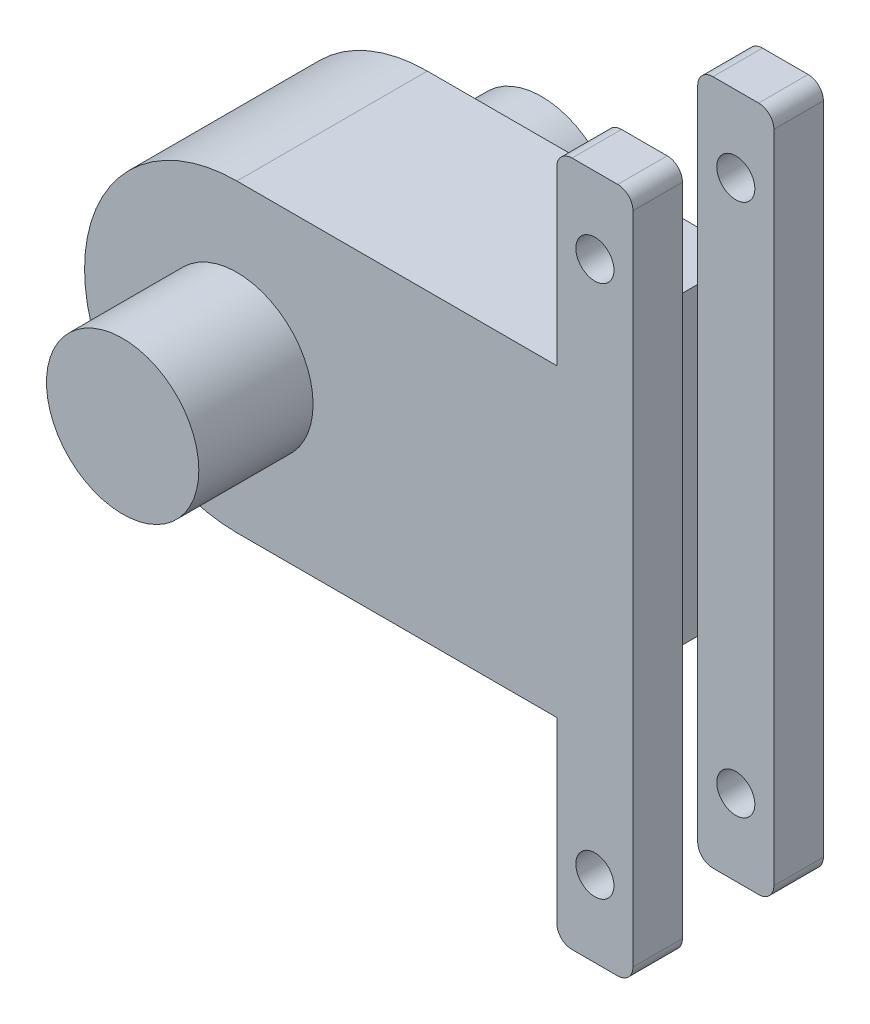
ISO-10303-21;
HEADER;
FILE_DESCRIPTION(('STEP AP214'),'2;1');
FILE_NAME('part.step','',(''),(''),'','','');
FILE_SCHEMA(('AUTOMOTIVE_DESIGN { 1 0 10303 214 1 1 1 1 }'));
ENDSEC;
DATA;
#1=APPLICATION_CONTEXT('core data for automotive mechanical design processes');
#2=APPLICATION_PROTOCOL_DEFINITION('international standard','automotive_design',2000,#1);
#3=PRODUCT_CONTEXT('',#1,'mechanical');
#4=PRODUCT('Part','Part','',(#3));
#5=PRODUCT_RELATED_PRODUCT_CATEGORY('part','',(#4));
#6=PRODUCT_DEFINITION_FORMATION('','',#4);
#7=PRODUCT_DEFINITION_CONTEXT('part definition',#1,'design');
#8=PRODUCT_DEFINITION('design','',#6,#7);
#9=PRODUCT_DEFINITION_SHAPE('','',#8);
#10=(LENGTH_UNIT() NAMED_UNIT(*) SI_UNIT(.MILLI.,.METRE.));
#11=(NAMED_UNIT(*) PLANE_ANGLE_UNIT() SI_UNIT($,.RADIAN.));
#12=(NAMED_UNIT(*) SI_UNIT($,.STERADIAN.) SOLID_ANGLE_UNIT());
#13=UNCERTAINTY_MEASURE_WITH_UNIT(LENGTH_MEASURE(1.E-05),#10,'distance_accuracy_value','');
#14=(GEOMETRIC_REPRESENTATION_CONTEXT(3) GLOBAL_UNCERTAINTY_ASSIGNED_CONTEXT((#13)) GLOBAL_UNIT_ASSIGNED_CONTEXT((#10,
#11,#12)) REPRESENTATION_CONTEXT('',''));
#15=CARTESIAN_POINT('',(0.,0.,0.));
#16=DIRECTION('',(0.,0.,1.));
#17=DIRECTION('',(1.,0.,0.));
#18=AXIS2_PLACEMENT_3D('',#15,#16,#17);
#19=CARTESIAN_POINT('',(42.,-45.,25.));
#20=DIRECTION('',(1.,0.,0.));
#21=DIRECTION('',(0.,1.,0.));
#22=AXIS2_PLACEMENT_3D('',#19,#20,#21);
#23=PLANE('',#22);
#24=DIRECTION('',(0.,-1.,0.));
#25=VECTOR('',#24,1.);
#26=CARTESIAN_POINT('',(42.,-45.,0.));
#27=LINE('',#26,#25);
#28=CARTESIAN_POINT('',(42.,-19.6168866981132,0.));
#29=VERTEX_POINT('',#28);
#30=CARTESIAN_POINT('',(42.,-43.,0.));
#31=VERTEX_POINT('',#30);
#32=EDGE_CURVE('E373',#29,#31,#27,.T.);
#33=ORIENTED_EDGE('',*,*,#32,.T.);
#34=DIRECTION('',(0.,0.,-1.));
#35=VECTOR('',#34,1.);
#36=CARTESIAN_POINT('',(42.,-43.,25.));
#37=LINE('',#36,#35);
#38=CARTESIAN_POINT('',(42.,-43.,6.5));
#39=VERTEX_POINT('',#38);
#40=EDGE_CURVE('E11',#31,#39,#37,.F.);
#41=ORIENTED_EDGE('',*,*,#40,.T.);
#42=DIRECTION('',(0.,1.,0.));
#43=VECTOR('',#42,1.);
#44=CARTESIAN_POINT('',(42.,-45.,6.5));
#45=LINE('',#44,#43);
#46=CARTESIAN_POINT('',(42.,-19.6168866981132,6.5));
#47=VERTEX_POINT('',#46);
#48=EDGE_CURVE('E252',#39,#47,#45,.T.);
#49=ORIENTED_EDGE('',*,*,#48,.T.);
#50=DIRECTION('',(0.,0.,-1.));
#51=VECTOR('',#50,1.);
#52=CARTESIAN_POINT('',(42.,-19.6168866981132,25.));
#53=LINE('',#52,#51);
#54=EDGE_CURVE('E227',#47,#29,#53,.T.);
#55=ORIENTED_EDGE('',*,*,#54,.T.);
#56=EDGE_LOOP('',(#33,#41,#49,#55));
#57=FACE_BOUND('',#56,.T.);
#58=ADVANCED_FACE('F45',(#57),#23,.F.);
#59=CARTESIAN_POINT('',(52.,-45.,25.));
#60=DIRECTION('',(0.,1.,0.));
#61=DIRECTION('',(0.,0.,1.));
#62=AXIS2_PLACEMENT_3D('',#59,#60,#61);
#63=PLANE('',#62);
#64=DIRECTION('',(-1.,0.,0.));
#65=VECTOR('',#64,1.);
#66=CARTESIAN_POINT('',(52.0157323800917,-45.,6.5));
#67=LINE('',#66,#65);
#68=CARTESIAN_POINT('',(50.,-45.,6.5));
#69=VERTEX_POINT('',#68);
#70=CARTESIAN_POINT('',(44.,-45.,6.5));
#71=VERTEX_POINT('',#70);
#72=EDGE_CURVE('E361',#69,#71,#67,.T.);
#73=ORIENTED_EDGE('',*,*,#72,.T.);
#74=DIRECTION('',(0.,0.,-1.));
#75=VECTOR('',#74,1.);
#76=CARTESIAN_POINT('',(44.,-45.,25.));
#77=LINE('',#76,#75);
#78=CARTESIAN_POINT('',(44.,-45.,0.));
#79=VERTEX_POINT('',#78);
#80=EDGE_CURVE('E54',#71,#79,#77,.T.);
#81=ORIENTED_EDGE('',*,*,#80,.T.);
#82=DIRECTION('',(1.,0.,0.));
#83=VECTOR('',#82,1.);
#84=CARTESIAN_POINT('',(52.,-45.,0.));
#85=LINE('',#84,#83);
#86=CARTESIAN_POINT('',(50.,-45.,0.));
#87=VERTEX_POINT('',#86);
#88=EDGE_CURVE('E359',#79,#87,#85,.T.);
#89=ORIENTED_EDGE('',*,*,#88,.T.);
#90=DIRECTION('',(0.,0.,-1.));
#91=VECTOR('',#90,1.);
#92=CARTESIAN_POINT('',(50.,-45.,25.));
#93=LINE('',#92,#91);
#94=EDGE_CURVE('E349',#87,#69,#93,.F.);
#95=ORIENTED_EDGE('',*,*,#94,.T.);
#96=EDGE_LOOP('',(#73,#81,#89,#95));
#97=FACE_BOUND('',#96,.T.);
#98=ADVANCED_FACE('F358',(#97),#63,.F.);
#99=CARTESIAN_POINT('',(52.,45.,25.));
#100=DIRECTION('',(-1.,0.,0.));
#101=DIRECTION('',(0.,-1.,0.));
#102=AXIS2_PLACEMENT_3D('',#99,#100,#101);
#103=PLANE('',#102);
#104=DIRECTION('',(0.,1.,0.));
#105=VECTOR('',#104,1.);
#106=CARTESIAN_POINT('',(52.,45.,0.));
#107=LINE('',#106,#105);
#108=CARTESIAN_POINT('',(52.,-43.,0.));
#109=VERTEX_POINT('',#108);
#110=CARTESIAN_POINT('',(52.,43.,0.));
#111=VERTEX_POINT('',#110);
#112=EDGE_CURVE('E372',#109,#111,#107,.T.);
#113=ORIENTED_EDGE('',*,*,#112,.T.);
#114=DIRECTION('',(0.,0.,-1.));
#115=VECTOR('',#114,1.);
#116=CARTESIAN_POINT('',(52.,43.,25.));
#117=LINE('',#116,#115);
#118=CARTESIAN_POINT('',(52.,43.,6.50000000000001));
#119=VERTEX_POINT('',#118);
#120=EDGE_CURVE('E68',#111,#119,#117,.F.);
#121=ORIENTED_EDGE('',*,*,#120,.T.);
#122=DIRECTION('',(0.,-1.,0.));
#123=VECTOR('',#122,1.);
#124=CARTESIAN_POINT('',(52.,45.,6.50000000000001));
#125=LINE('',#124,#123);
#126=CARTESIAN_POINT('',(52.,-43.,6.50000000000001));
#127=VERTEX_POINT('',#126);
#128=EDGE_CURVE('E230',#119,#127,#125,.T.);
#129=ORIENTED_EDGE('',*,*,#128,.T.);
#130=DIRECTION('',(0.,0.,-1.));
#131=VECTOR('',#130,1.);
#132=CARTESIAN_POINT('',(52.,-43.,25.));
#133=LINE('',#132,#131);
#134=EDGE_CURVE('E326',#127,#109,#133,.T.);
#135=ORIENTED_EDGE('',*,*,#134,.T.);
#136=EDGE_LOOP('',(#113,#121,#129,#135));
#137=FACE_BOUND('',#136,.T.);
#138=ADVANCED_FACE('F452',(#137),#103,.F.);
#139=CARTESIAN_POINT('',(42.,45.,25.));
#140=DIRECTION('',(0.,-1.,0.));
#141=DIRECTION('',(0.,0.,-1.));
#142=AXIS2_PLACEMENT_3D('',#139,#140,#141);
#143=PLANE('',#142);
#144=DIRECTION('',(-1.,0.,0.));
#145=VECTOR('',#144,1.);
#146=CARTESIAN_POINT('',(42.,45.,0.));
#147=LINE('',#146,#145);
#148=CARTESIAN_POINT('',(50.,45.,0.));
#149=VERTEX_POINT('',#148);
#150=CARTESIAN_POINT('',(44.,45.,0.));
#151=VERTEX_POINT('',#150);
#152=EDGE_CURVE('E377',#149,#151,#147,.T.);
#153=ORIENTED_EDGE('',*,*,#152,.T.);
#154=DIRECTION('',(0.,0.,-1.));
#155=VECTOR('',#154,1.);
#156=CARTESIAN_POINT('',(44.,45.,25.));
#157=LINE('',#156,#155);
#158=CARTESIAN_POINT('',(44.,45.,6.5));
#159=VERTEX_POINT('',#158);
#160=EDGE_CURVE('E312',#151,#159,#157,.F.);
#161=ORIENTED_EDGE('',*,*,#160,.T.);
#162=DIRECTION('',(1.,0.,0.));
#163=VECTOR('',#162,1.);
#164=CARTESIAN_POINT('',(42.,45.,6.5));
#165=LINE('',#164,#163);
#166=CARTESIAN_POINT('',(50.,45.,6.5));
#167=VERTEX_POINT('',#166);
#168=EDGE_CURVE('E448',#159,#167,#165,.T.);
#169=ORIENTED_EDGE('',*,*,#168,.T.);
#170=DIRECTION('',(0.,0.,-1.));
#171=VECTOR('',#170,1.);
#172=CARTESIAN_POINT('',(50.,45.,25.));
#173=LINE('',#172,#171);
#174=EDGE_CURVE('E308',#167,#149,#173,.T.);
#175=ORIENTED_EDGE('',*,*,#174,.T.);
#176=EDGE_LOOP('',(#153,#161,#169,#175));
#177=FACE_BOUND('',#176,.T.);
#178=ADVANCED_FACE('F445',(#177),#143,.F.);
#179=CARTESIAN_POINT('',(42.,20.3831133018868,25.));
#180=DIRECTION('',(1.,0.,0.));
#181=DIRECTION('',(0.,1.,0.));
#182=AXIS2_PLACEMENT_3D('',#179,#180,#181);
#183=PLANE('',#182);
#184=CARTESIAN_POINT('',(42.,20.3831133018868,6.50000000000001));
#185=VERTEX_POINT('',#184);
#186=CARTESIAN_POINT('',(42.,43.,6.5));
#187=VERTEX_POINT('',#186);
#188=EDGE_CURVE('E208',#185,#187,#45,.T.);
#189=ORIENTED_EDGE('',*,*,#188,.T.);
#190=DIRECTION('',(0.,0.,-1.));
#191=VECTOR('',#190,1.);
#192=CARTESIAN_POINT('',(42.,43.,25.));
#193=LINE('',#192,#191);
#194=CARTESIAN_POINT('',(42.,43.,0.));
#195=VERTEX_POINT('',#194);
#196=EDGE_CURVE('E292',#187,#195,#193,.T.);
#197=ORIENTED_EDGE('',*,*,#196,.T.);
#198=DIRECTION('',(0.,-1.,0.));
#199=VECTOR('',#198,1.);
#200=CARTESIAN_POINT('',(42.,20.3831133018868,0.));
#201=LINE('',#200,#199);
#202=CARTESIAN_POINT('',(42.,20.3831133018868,0.));
#203=VERTEX_POINT('',#202);
#204=EDGE_CURVE('E386',#195,#203,#201,.T.);
#205=ORIENTED_EDGE('',*,*,#204,.T.);
#206=DIRECTION('',(0.,0.,-1.));
#207=VECTOR('',#206,1.);
#208=CARTESIAN_POINT('',(42.,20.3831133018868,25.));
#209=LINE('',#208,#207);
#210=EDGE_CURVE('E395',#185,#203,#209,.T.);
#211=ORIENTED_EDGE('',*,*,#210,.F.);
#212=EDGE_LOOP('',(#189,#197,#205,#211));
#213=FACE_BOUND('',#212,.T.);
#214=ADVANCED_FACE('F437',(#213),#183,.F.);
#215=CARTESIAN_POINT('',(47.,35.,25.));
#216=DIRECTION('',(0.,0.,-1.));
#217=DIRECTION('',(-1.,0.,0.));
#218=AXIS2_PLACEMENT_3D('',#215,#216,#217);
#219=CYLINDRICAL_SURFACE('',#218,2.5);
#220=CARTESIAN_POINT('',(47.,35.,6.5));
#221=DIRECTION('',(0.,0.,-1.));
#222=DIRECTION('',(-1.,0.,0.));
#223=AXIS2_PLACEMENT_3D('',#220,#221,#222);
#224=CIRCLE('',#223,2.5);
#225=CARTESIAN_POINT('',(44.5,35.,6.5));
#226=VERTEX_POINT('',#225);
#227=EDGE_CURVE('E257',#226,#226,#224,.T.);
#228=ORIENTED_EDGE('',*,*,#227,.F.);
#229=EDGE_LOOP('',(#228));
#230=FACE_BOUND('',#229,.T.);
#231=CARTESIAN_POINT('',(47.,35.,0.));
#232=DIRECTION('',(0.,0.,1.));
#233=DIRECTION('',(1.,0.,0.));
#234=AXIS2_PLACEMENT_3D('',#231,#232,#233);
#235=CIRCLE('',#234,2.5);
#236=CARTESIAN_POINT('',(49.5,35.,0.));
#237=VERTEX_POINT('',#236);
#238=EDGE_CURVE('E754',#237,#237,#235,.T.);
#239=ORIENTED_EDGE('',*,*,#238,.F.);
#240=EDGE_LOOP('',(#239));
#241=FACE_BOUND('',#240,.T.);
#242=ADVANCED_FACE('F600',(#230,#241),#219,.F.);
#243=CARTESIAN_POINT('',(47.,-35.,25.));
#244=DIRECTION('',(0.,0.,-1.));
#245=DIRECTION('',(-1.,0.,0.));
#246=AXIS2_PLACEMENT_3D('',#243,#244,#245);
#247=CYLINDRICAL_SURFACE('',#246,2.5);
#248=CARTESIAN_POINT('',(47.,-35.,6.5));
#249=DIRECTION('',(0.,0.,-1.));
#250=DIRECTION('',(-1.,0.,0.));
#251=AXIS2_PLACEMENT_3D('',#248,#249,#250);
#252=CIRCLE('',#251,2.5);
#253=CARTESIAN_POINT('',(44.5,-35.,6.5));
#254=VERTEX_POINT('',#253);
#255=EDGE_CURVE('E253',#254,#254,#252,.T.);
#256=ORIENTED_EDGE('',*,*,#255,.F.);
#257=EDGE_LOOP('',(#256));
#258=FACE_BOUND('',#257,.T.);
#259=CARTESIAN_POINT('',(47.,-35.,0.));
#260=DIRECTION('',(0.,0.,1.));
#261=DIRECTION('',(-1.,0.,0.));
#262=AXIS2_PLACEMENT_3D('',#259,#260,#261);
#263=CIRCLE('',#262,2.5);
#264=CARTESIAN_POINT('',(44.5,-35.,0.));
#265=VERTEX_POINT('',#264);
#266=EDGE_CURVE('E755',#265,#265,#263,.T.);
#267=ORIENTED_EDGE('',*,*,#266,.F.);
#268=EDGE_LOOP('',(#267));
#269=FACE_BOUND('',#268,.T.);
#270=ADVANCED_FACE('F611',(#258,#269),#247,.F.);
#271=CARTESIAN_POINT('',(0.,0.383113301886791,25.));
#272=DIRECTION('',(0.,0.,1.));
#273=DIRECTION('',(1.,0.,0.));
#274=AXIS2_PLACEMENT_3D('',#271,#272,#273);
#275=PLANE('',#274);
#276=CARTESIAN_POINT('',(0.,0.,25.));
#277=DIRECTION('',(0.,0.,1.));
#278=DIRECTION('',(1.,0.,0.));
#279=AXIS2_PLACEMENT_3D('',#276,#277,#278);
#280=CIRCLE('',#279,10.);
#281=CARTESIAN_POINT('',(10.,0.,25.));
#282=VERTEX_POINT('',#281);
#283=EDGE_CURVE('E742',#282,#282,#280,.T.);
#284=ORIENTED_EDGE('',*,*,#283,.F.);
#285=EDGE_LOOP('',(#284));
#286=FACE_BOUND('',#285,.T.);
#287=CARTESIAN_POINT('',(47.,35.,25.));
#288=DIRECTION('',(0.,0.,1.));
#289=DIRECTION('',(1.,0.,0.));
#290=AXIS2_PLACEMENT_3D('',#287,#288,#289);
#291=CIRCLE('',#290,2.5);
#292=CARTESIAN_POINT('',(49.5,35.,25.));
#293=VERTEX_POINT('',#292);
#294=EDGE_CURVE('E417',#293,#293,#291,.T.);
#295=ORIENTED_EDGE('',*,*,#294,.F.);
#296=EDGE_LOOP('',(#295));
#297=FACE_BOUND('',#296,.T.);
#298=DIRECTION('',(-1.,0.,0.));
#299=VECTOR('',#298,1.);
#300=CARTESIAN_POINT('',(42.,45.,25.));
#301=LINE('',#300,#299);
#302=CARTESIAN_POINT('',(50.,45.,25.));
#303=VERTEX_POINT('',#302);
#304=CARTESIAN_POINT('',(44.,45.,25.));
#305=VERTEX_POINT('',#304);
#306=EDGE_CURVE('E411',#303,#305,#301,.T.);
#307=ORIENTED_EDGE('',*,*,#306,.T.);
#308=CARTESIAN_POINT('',(44.,43.,25.));
#309=DIRECTION('',(0.,0.,1.));
#310=DIRECTION('',(1.,0.,0.));
#311=AXIS2_PLACEMENT_3D('',#308,#309,#310);
#312=CIRCLE('',#311,2.);
#313=CARTESIAN_POINT('',(42.,43.,25.));
#314=VERTEX_POINT('',#313);
#315=EDGE_CURVE('E289',#305,#314,#312,.T.);
#316=ORIENTED_EDGE('',*,*,#315,.T.);
#317=DIRECTION('',(0.,-1.,0.));
#318=VECTOR('',#317,1.);
#319=CARTESIAN_POINT('',(42.,20.3831133018868,25.));
#320=LINE('',#319,#318);
#321=CARTESIAN_POINT('',(42.,20.3831133018868,25.));
#322=VERTEX_POINT('',#321);
#323=EDGE_CURVE('E405',#314,#322,#320,.T.);
#324=ORIENTED_EDGE('',*,*,#323,.T.);
#325=DIRECTION('',(-1.,0.,0.));
#326=VECTOR('',#325,1.);
#327=CARTESIAN_POINT('',(0.,20.3831133018868,25.));
#328=LINE('',#327,#326);
#329=CARTESIAN_POINT('',(0.,20.3831133018868,25.));
#330=VERTEX_POINT('',#329);
#331=EDGE_CURVE('E396',#322,#330,#328,.T.);
#332=ORIENTED_EDGE('',*,*,#331,.T.);
#333=CARTESIAN_POINT('',(0.,0.383113301886791,25.));
#334=DIRECTION('',(0.,0.,1.));
#335=DIRECTION('',(1.,0.,0.));
#336=AXIS2_PLACEMENT_3D('',#333,#334,#335);
#337=CIRCLE('',#336,20.);
#338=CARTESIAN_POINT('',(0.,-19.6168866981132,25.));
#339=VERTEX_POINT('',#338);
#340=EDGE_CURVE('E391',#330,#339,#337,.T.);
#341=ORIENTED_EDGE('',*,*,#340,.T.);
#342=DIRECTION('',(1.,0.,0.));
#343=VECTOR('',#342,1.);
#344=CARTESIAN_POINT('',(0.,-19.6168866981132,25.));
#345=LINE('',#344,#343);
#346=CARTESIAN_POINT('',(42.,-19.6168866981132,25.));
#347=VERTEX_POINT('',#346);
#348=EDGE_CURVE('E771',#339,#347,#345,.T.);
#349=ORIENTED_EDGE('',*,*,#348,.T.);
#350=DIRECTION('',(0.,-1.,0.));
#351=VECTOR('',#350,1.);
#352=CARTESIAN_POINT('',(42.,-45.,25.));
#353=LINE('',#352,#351);
#354=CARTESIAN_POINT('',(42.,-43.,25.));
#355=VERTEX_POINT('',#354);
#356=EDGE_CURVE('E234',#347,#355,#353,.T.);
#357=ORIENTED_EDGE('',*,*,#356,.T.);
#358=CARTESIAN_POINT('',(44.,-43.,25.));
#359=DIRECTION('',(0.,0.,1.));
#360=DIRECTION('',(1.,0.,0.));
#361=AXIS2_PLACEMENT_3D('',#358,#359,#360);
#362=CIRCLE('',#361,2.);
#363=CARTESIAN_POINT('',(44.,-45.,25.));
#364=VERTEX_POINT('',#363);
#365=EDGE_CURVE('E283',#355,#364,#362,.T.);
#366=ORIENTED_EDGE('',*,*,#365,.T.);
#367=DIRECTION('',(1.,0.,0.));
#368=VECTOR('',#367,1.);
#369=CARTESIAN_POINT('',(52.,-45.,25.));
#370=LINE('',#369,#368);
#371=CARTESIAN_POINT('',(50.,-45.,25.));
#372=VERTEX_POINT('',#371);
#373=EDGE_CURVE('E776',#364,#372,#370,.T.);
#374=ORIENTED_EDGE('',*,*,#373,.T.);
#375=CARTESIAN_POINT('',(50.,-43.,25.));
#376=DIRECTION('',(0.,0.,1.));
#377=DIRECTION('',(1.,0.,0.));
#378=AXIS2_PLACEMENT_3D('',#375,#376,#377);
#379=CIRCLE('',#378,2.);
#380=CARTESIAN_POINT('',(52.,-43.,25.));
#381=VERTEX_POINT('',#380);
#382=EDGE_CURVE('E280',#372,#381,#379,.T.);
#383=ORIENTED_EDGE('',*,*,#382,.T.);
#384=DIRECTION('',(0.,1.,0.));
#385=VECTOR('',#384,1.);
#386=CARTESIAN_POINT('',(52.,45.,25.));
#387=LINE('',#386,#385);
#388=CARTESIAN_POINT('',(52.,43.,25.));
#389=VERTEX_POINT('',#388);
#390=EDGE_CURVE('E780',#381,#389,#387,.T.);
#391=ORIENTED_EDGE('',*,*,#390,.T.);
#392=CARTESIAN_POINT('',(50.,43.,25.));
#393=DIRECTION('',(0.,0.,1.));
#394=DIRECTION('',(1.,0.,0.));
#395=AXIS2_PLACEMENT_3D('',#392,#393,#394);
#396=CIRCLE('',#395,2.);
#397=EDGE_CURVE('E286',#389,#303,#396,.T.);
#398=ORIENTED_EDGE('',*,*,#397,.T.);
#399=EDGE_LOOP('',(#307,#316,#324,#332,#341,#349,#357,#366,#374,#383,#391,#398));
#400=FACE_BOUND('',#399,.T.);
#401=CARTESIAN_POINT('',(47.,-35.,25.));
#402=DIRECTION('',(0.,0.,1.));
#403=DIRECTION('',(-1.,0.,0.));
#404=AXIS2_PLACEMENT_3D('',#401,#402,#403);
#405=CIRCLE('',#404,2.5);
#406=CARTESIAN_POINT('',(44.5,-35.,25.));
#407=VERTEX_POINT('',#406);
#408=EDGE_CURVE('E751',#407,#407,#405,.T.);
#409=ORIENTED_EDGE('',*,*,#408,.F.);
#410=EDGE_LOOP('',(#409));
#411=FACE_BOUND('',#410,.T.);
#412=ADVANCED_FACE('F622',(#286,#297,#400,#411),#275,.T.);
#413=CARTESIAN_POINT('',(0.,0.383113301886791,0.));
#414=DIRECTION('',(0.,0.,1.));
#415=DIRECTION('',(1.,0.,0.));
#416=AXIS2_PLACEMENT_3D('',#413,#414,#415);
#417=PLANE('',#416);
#418=CARTESIAN_POINT('',(0.,0.,0.));
#419=DIRECTION('',(0.,0.,1.));
#420=DIRECTION('',(1.,0.,0.));
#421=AXIS2_PLACEMENT_3D('',#418,#419,#420);
#422=CIRCLE('',#421,10.);
#423=CARTESIAN_POINT('',(10.,0.,0.));
#424=VERTEX_POINT('',#423);
#425=EDGE_CURVE('E229',#424,#424,#422,.T.);
#426=ORIENTED_EDGE('',*,*,#425,.T.);
#427=EDGE_LOOP('',(#426));
#428=FACE_BOUND('',#427,.T.);
#429=ORIENTED_EDGE('',*,*,#204,.F.);
#430=CARTESIAN_POINT('',(44.,43.,0.));
#431=DIRECTION('',(0.,0.,1.));
#432=DIRECTION('',(1.,0.,0.));
#433=AXIS2_PLACEMENT_3D('',#430,#431,#432);
#434=CIRCLE('',#433,2.);
#435=EDGE_CURVE('E305',#195,#151,#434,.F.);
#436=ORIENTED_EDGE('',*,*,#435,.T.);
#437=ORIENTED_EDGE('',*,*,#152,.F.);
#438=CARTESIAN_POINT('',(50.,43.,0.));
#439=DIRECTION('',(0.,0.,1.));
#440=DIRECTION('',(1.,0.,0.));
#441=AXIS2_PLACEMENT_3D('',#438,#439,#440);
#442=CIRCLE('',#441,2.);
#443=EDGE_CURVE('E302',#149,#111,#442,.F.);
#444=ORIENTED_EDGE('',*,*,#443,.T.);
#445=ORIENTED_EDGE('',*,*,#112,.F.);
#446=CARTESIAN_POINT('',(50.,-43.,0.));
#447=DIRECTION('',(0.,0.,1.));
#448=DIRECTION('',(1.,0.,0.));
#449=AXIS2_PLACEMENT_3D('',#446,#447,#448);
#450=CIRCLE('',#449,2.);
#451=EDGE_CURVE('E296',#109,#87,#450,.F.);
#452=ORIENTED_EDGE('',*,*,#451,.T.);
#453=ORIENTED_EDGE('',*,*,#88,.F.);
#454=CARTESIAN_POINT('',(44.,-43.,0.));
#455=DIRECTION('',(0.,0.,1.));
#456=DIRECTION('',(1.,0.,0.));
#457=AXIS2_PLACEMENT_3D('',#454,#455,#456);
#458=CIRCLE('',#457,2.);
#459=EDGE_CURVE('E299',#79,#31,#458,.F.);
#460=ORIENTED_EDGE('',*,*,#459,.T.);
#461=ORIENTED_EDGE('',*,*,#32,.F.);
#462=DIRECTION('',(1.,0.,0.));
#463=VECTOR('',#462,1.);
#464=CARTESIAN_POINT('',(0.,-19.6168866981132,0.));
#465=LINE('',#464,#463);
#466=CARTESIAN_POINT('',(0.,-19.6168866981132,0.));
#467=VERTEX_POINT('',#466);
#468=EDGE_CURVE('E379',#467,#29,#465,.T.);
#469=ORIENTED_EDGE('',*,*,#468,.F.);
#470=CARTESIAN_POINT('',(0.,0.383113301886791,0.));
#471=DIRECTION('',(0.,0.,1.));
#472=DIRECTION('',(1.,0.,0.));
#473=AXIS2_PLACEMENT_3D('',#470,#471,#472);
#474=CIRCLE('',#473,20.);
#475=CARTESIAN_POINT('',(0.,20.3831133018868,0.));
#476=VERTEX_POINT('',#475);
#477=EDGE_CURVE('E415',#476,#467,#474,.T.);
#478=ORIENTED_EDGE('',*,*,#477,.F.);
#479=DIRECTION('',(-1.,0.,0.));
#480=VECTOR('',#479,1.);
#481=CARTESIAN_POINT('',(0.,20.3831133018868,0.));
#482=LINE('',#481,#480);
#483=EDGE_CURVE('E389',#203,#476,#482,.T.);
#484=ORIENTED_EDGE('',*,*,#483,.F.);
#485=EDGE_LOOP('',(#429,#436,#437,#444,#445,#452,#453,#460,#461,#469,#478,#484));
#486=FACE_BOUND('',#485,.T.);
#487=ORIENTED_EDGE('',*,*,#238,.T.);
#488=EDGE_LOOP('',(#487));
#489=FACE_BOUND('',#488,.T.);
#490=ORIENTED_EDGE('',*,*,#266,.T.);
#491=EDGE_LOOP('',(#490));
#492=FACE_BOUND('',#491,.T.);
#493=ADVANCED_FACE('F366',(#428,#486,#489,#492),#417,.F.);
#494=CARTESIAN_POINT('',(0.,0.383113301886791,25.));
#495=DIRECTION('',(0.,0.,-1.));
#496=DIRECTION('',(-1.,0.,0.));
#497=AXIS2_PLACEMENT_3D('',#494,#495,#496);
#498=CYLINDRICAL_SURFACE('',#497,20.);
#499=ORIENTED_EDGE('',*,*,#477,.T.);
#500=DIRECTION('',(0.,0.,-1.));
#501=VECTOR('',#500,1.);
#502=CARTESIAN_POINT('',(0.,-19.6168866981132,25.));
#503=LINE('',#502,#501);
#504=EDGE_CURVE('E236',#339,#467,#503,.T.);
#505=ORIENTED_EDGE('',*,*,#504,.F.);
#506=ORIENTED_EDGE('',*,*,#340,.F.);
#507=DIRECTION('',(0.,0.,-1.));
#508=VECTOR('',#507,1.);
#509=CARTESIAN_POINT('',(0.,20.3831133018868,25.));
#510=LINE('',#509,#508);
#511=EDGE_CURVE('E392',#330,#476,#510,.T.);
#512=ORIENTED_EDGE('',*,*,#511,.T.);
#513=EDGE_LOOP('',(#499,#505,#506,#512));
#514=FACE_BOUND('',#513,.T.);
#515=ADVANCED_FACE('F478',(#514),#498,.T.);
#516=CARTESIAN_POINT('',(0.,-19.6168866981132,25.));
#517=DIRECTION('',(0.,1.,0.));
#518=DIRECTION('',(-1.,0.,0.));
#519=AXIS2_PLACEMENT_3D('',#516,#517,#518);
#520=PLANE('',#519);
#521=ORIENTED_EDGE('',*,*,#468,.T.);
#522=ORIENTED_EDGE('',*,*,#54,.F.);
#523=DIRECTION('',(0.,0.,1.));
#524=VECTOR('',#523,1.);
#525=CARTESIAN_POINT('',(42.,-19.6168866981132,25.));
#526=LINE('',#525,#524);
#527=CARTESIAN_POINT('',(42.,-19.6168866981132,18.5));
#528=VERTEX_POINT('',#527);
#529=EDGE_CURVE('E215',#47,#528,#526,.T.);
#530=ORIENTED_EDGE('',*,*,#529,.T.);
#531=EDGE_CURVE('E225',#347,#528,#53,.T.);
#532=ORIENTED_EDGE('',*,*,#531,.F.);
#533=ORIENTED_EDGE('',*,*,#348,.F.);
#534=ORIENTED_EDGE('',*,*,#504,.T.);
#535=EDGE_LOOP('',(#521,#522,#530,#532,#533,#534));
#536=FACE_BOUND('',#535,.T.);
#537=ADVANCED_FACE('F224',(#536),#520,.F.);
#538=DIRECTION('',(0.,1.,0.));
#539=VECTOR('',#538,1.);
#540=CARTESIAN_POINT('',(42.,-45.,18.5));
#541=LINE('',#540,#539);
#542=CARTESIAN_POINT('',(42.,-43.,18.5));
#543=VERTEX_POINT('',#542);
#544=EDGE_CURVE('E196',#543,#528,#541,.T.);
#545=ORIENTED_EDGE('',*,*,#544,.F.);
#546=DIRECTION('',(0.,0.,-1.));
#547=VECTOR('',#546,1.);
#548=CARTESIAN_POINT('',(42.,-43.,25.));
#549=LINE('',#548,#547);
#550=EDGE_CURVE('E346',#543,#355,#549,.F.);
#551=ORIENTED_EDGE('',*,*,#550,.T.);
#552=ORIENTED_EDGE('',*,*,#356,.F.);
#553=ORIENTED_EDGE('',*,*,#531,.T.);
#554=EDGE_LOOP('',(#545,#551,#552,#553));
#555=FACE_BOUND('',#554,.T.);
#556=ADVANCED_FACE('F232',(#555),#23,.F.);
#557=ORIENTED_EDGE('',*,*,#373,.F.);
#558=DIRECTION('',(0.,0.,-1.));
#559=VECTOR('',#558,1.);
#560=CARTESIAN_POINT('',(44.,-45.,25.));
#561=LINE('',#560,#559);
#562=CARTESIAN_POINT('',(44.,-45.,18.5));
#563=VERTEX_POINT('',#562);
#564=EDGE_CURVE('E342',#364,#563,#561,.T.);
#565=ORIENTED_EDGE('',*,*,#564,.T.);
#566=DIRECTION('',(1.,0.,0.));
#567=VECTOR('',#566,1.);
#568=CARTESIAN_POINT('',(52.0157323800917,-45.,18.5));
#569=LINE('',#568,#567);
#570=CARTESIAN_POINT('',(50.,-45.,18.5));
#571=VERTEX_POINT('',#570);
#572=EDGE_CURVE('E838',#563,#571,#569,.T.);
#573=ORIENTED_EDGE('',*,*,#572,.T.);
#574=DIRECTION('',(0.,0.,-1.));
#575=VECTOR('',#574,1.);
#576=CARTESIAN_POINT('',(50.,-45.,25.));
#577=LINE('',#576,#575);
#578=EDGE_CURVE('E339',#571,#372,#577,.F.);
#579=ORIENTED_EDGE('',*,*,#578,.T.);
#580=EDGE_LOOP('',(#557,#565,#573,#579));
#581=FACE_BOUND('',#580,.T.);
#582=ADVANCED_FACE('F468',(#581),#63,.F.);
#583=DIRECTION('',(0.,1.,0.));
#584=VECTOR('',#583,1.);
#585=CARTESIAN_POINT('',(52.,45.,18.5));
#586=LINE('',#585,#584);
#587=CARTESIAN_POINT('',(52.,-43.,18.5));
#588=VERTEX_POINT('',#587);
#589=CARTESIAN_POINT('',(52.,43.,18.5));
#590=VERTEX_POINT('',#589);
#591=EDGE_CURVE('E258',#588,#590,#586,.T.);
#592=ORIENTED_EDGE('',*,*,#591,.T.);
#593=DIRECTION('',(0.,0.,-1.));
#594=VECTOR('',#593,1.);
#595=CARTESIAN_POINT('',(52.,43.,25.));
#596=LINE('',#595,#594);
#597=EDGE_CURVE('E336',#590,#389,#596,.F.);
#598=ORIENTED_EDGE('',*,*,#597,.T.);
#599=ORIENTED_EDGE('',*,*,#390,.F.);
#600=DIRECTION('',(0.,0.,-1.));
#601=VECTOR('',#600,1.);
#602=CARTESIAN_POINT('',(52.,-43.,25.));
#603=LINE('',#602,#601);
#604=EDGE_CURVE('E332',#381,#588,#603,.T.);
#605=ORIENTED_EDGE('',*,*,#604,.T.);
#606=EDGE_LOOP('',(#592,#598,#599,#605));
#607=FACE_BOUND('',#606,.T.);
#608=ADVANCED_FACE('F475',(#607),#103,.F.);
#609=DIRECTION('',(-1.,0.,0.));
#610=VECTOR('',#609,1.);
#611=CARTESIAN_POINT('',(42.,45.,18.5));
#612=LINE('',#611,#610);
#613=CARTESIAN_POINT('',(50.,45.,18.5));
#614=VERTEX_POINT('',#613);
#615=CARTESIAN_POINT('',(44.,45.,18.5));
#616=VERTEX_POINT('',#615);
#617=EDGE_CURVE('E792',#614,#616,#612,.T.);
#618=ORIENTED_EDGE('',*,*,#617,.T.);
#619=DIRECTION('',(0.,0.,-1.));
#620=VECTOR('',#619,1.);
#621=CARTESIAN_POINT('',(44.,45.,25.));
#622=LINE('',#621,#620);
#623=EDGE_CURVE('E277',#616,#305,#622,.F.);
#624=ORIENTED_EDGE('',*,*,#623,.T.);
#625=ORIENTED_EDGE('',*,*,#306,.F.);
#626=DIRECTION('',(0.,0.,-1.));
#627=VECTOR('',#626,1.);
#628=CARTESIAN_POINT('',(50.,45.,25.));
#629=LINE('',#628,#627);
#630=EDGE_CURVE('E273',#303,#614,#629,.T.);
#631=ORIENTED_EDGE('',*,*,#630,.T.);
#632=EDGE_LOOP('',(#618,#624,#625,#631));
#633=FACE_BOUND('',#632,.T.);
#634=ADVANCED_FACE('F592',(#633),#143,.F.);
#635=ORIENTED_EDGE('',*,*,#323,.F.);
#636=DIRECTION('',(0.,0.,-1.));
#637=VECTOR('',#636,1.);
#638=CARTESIAN_POINT('',(42.,43.,25.));
#639=LINE('',#638,#637);
#640=CARTESIAN_POINT('',(42.,43.,18.5));
#641=VERTEX_POINT('',#640);
#642=EDGE_CURVE('E241',#314,#641,#639,.T.);
#643=ORIENTED_EDGE('',*,*,#642,.T.);
#644=CARTESIAN_POINT('',(42.,20.3831133018867,18.5));
#645=VERTEX_POINT('',#644);
#646=EDGE_CURVE('E210',#645,#641,#541,.T.);
#647=ORIENTED_EDGE('',*,*,#646,.F.);
#648=EDGE_CURVE('E243',#322,#645,#209,.T.);
#649=ORIENTED_EDGE('',*,*,#648,.F.);
#650=EDGE_LOOP('',(#635,#643,#647,#649));
#651=FACE_BOUND('',#650,.T.);
#652=ADVANCED_FACE('F602',(#651),#183,.F.);
#653=CARTESIAN_POINT('',(0.,20.3831133018868,25.));
#654=DIRECTION('',(0.,-1.,0.));
#655=DIRECTION('',(1.,0.,0.));
#656=AXIS2_PLACEMENT_3D('',#653,#654,#655);
#657=PLANE('',#656);
#658=ORIENTED_EDGE('',*,*,#483,.T.);
#659=ORIENTED_EDGE('',*,*,#511,.F.);
#660=ORIENTED_EDGE('',*,*,#331,.F.);
#661=ORIENTED_EDGE('',*,*,#648,.T.);
#662=EDGE_CURVE('E218',#645,#185,#209,.T.);
#663=ORIENTED_EDGE('',*,*,#662,.T.);
#664=ORIENTED_EDGE('',*,*,#210,.T.);
#665=EDGE_LOOP('',(#658,#659,#660,#661,#663,#664));
#666=FACE_BOUND('',#665,.T.);
#667=ADVANCED_FACE('F674',(#666),#657,.F.);
#668=CARTESIAN_POINT('',(47.,35.,18.5));
#669=DIRECTION('',(0.,0.,1.));
#670=DIRECTION('',(1.,0.,0.));
#671=AXIS2_PLACEMENT_3D('',#668,#669,#670);
#672=CIRCLE('',#671,2.5);
#673=CARTESIAN_POINT('',(49.5,35.,18.5));
#674=VERTEX_POINT('',#673);
#675=EDGE_CURVE('E251',#674,#674,#672,.T.);
#676=ORIENTED_EDGE('',*,*,#675,.F.);
#677=EDGE_LOOP('',(#676));
#678=FACE_BOUND('',#677,.T.);
#679=ORIENTED_EDGE('',*,*,#294,.T.);
#680=EDGE_LOOP('',(#679));
#681=FACE_BOUND('',#680,.T.);
#682=ADVANCED_FACE('F614',(#678,#681),#219,.F.);
#683=CARTESIAN_POINT('',(47.,-35.,18.5));
#684=DIRECTION('',(0.,0.,1.));
#685=DIRECTION('',(1.,0.,0.));
#686=AXIS2_PLACEMENT_3D('',#683,#684,#685);
#687=CIRCLE('',#686,2.5);
#688=CARTESIAN_POINT('',(49.5,-35.,18.5));
#689=VERTEX_POINT('',#688);
#690=EDGE_CURVE('E247',#689,#689,#687,.T.);
#691=ORIENTED_EDGE('',*,*,#690,.F.);
#692=EDGE_LOOP('',(#691));
#693=FACE_BOUND('',#692,.T.);
#694=ORIENTED_EDGE('',*,*,#408,.T.);
#695=EDGE_LOOP('',(#694));
#696=FACE_BOUND('',#695,.T.);
#697=ADVANCED_FACE('F625',(#693,#696),#247,.F.);
#698=CARTESIAN_POINT('',(0.,0.,40.));
#699=DIRECTION('',(0.,0.,-1.));
#700=DIRECTION('',(-1.,0.,0.));
#701=AXIS2_PLACEMENT_3D('',#698,#699,#700);
#702=CYLINDRICAL_SURFACE('',#701,10.);
#703=CARTESIAN_POINT('',(0.,0.,40.));
#704=DIRECTION('',(0.,0.,1.));
#705=DIRECTION('',(1.,0.,0.));
#706=AXIS2_PLACEMENT_3D('',#703,#704,#705);
#707=CIRCLE('',#706,10.);
#708=CARTESIAN_POINT('',(10.,0.,40.));
#709=VERTEX_POINT('',#708);
#710=EDGE_CURVE('E762',#709,#709,#707,.T.);
#711=ORIENTED_EDGE('',*,*,#710,.F.);
#712=EDGE_LOOP('',(#711));
#713=FACE_BOUND('',#712,.T.);
#714=ORIENTED_EDGE('',*,*,#283,.T.);
#715=EDGE_LOOP('',(#714));
#716=FACE_BOUND('',#715,.T.);
#717=ADVANCED_FACE('F650',(#713,#716),#702,.T.);
#718=CARTESIAN_POINT('',(0.,0.,40.));
#719=DIRECTION('',(0.,0.,1.));
#720=DIRECTION('',(1.,0.,0.));
#721=AXIS2_PLACEMENT_3D('',#718,#719,#720);
#722=PLANE('',#721);
#723=ORIENTED_EDGE('',*,*,#710,.T.);
#724=EDGE_LOOP('',(#723));
#725=FACE_BOUND('',#724,.T.);
#726=ADVANCED_FACE('F641',(#725),#722,.T.);
#727=CARTESIAN_POINT('',(0.,0.,-15.));
#728=DIRECTION('',(0.,0.,1.));
#729=DIRECTION('',(1.,0.,0.));
#730=AXIS2_PLACEMENT_3D('',#727,#728,#729);
#731=CYLINDRICAL_SURFACE('',#730,10.);
#732=CARTESIAN_POINT('',(0.,0.,-15.));
#733=DIRECTION('',(0.,0.,1.));
#734=DIRECTION('',(1.,0.,0.));
#735=AXIS2_PLACEMENT_3D('',#732,#733,#734);
#736=CIRCLE('',#735,10.);
#737=CARTESIAN_POINT('',(10.,0.,-15.));
#738=VERTEX_POINT('',#737);
#739=EDGE_CURVE('E811',#738,#738,#736,.T.);
#740=ORIENTED_EDGE('',*,*,#739,.T.);
#741=EDGE_LOOP('',(#740));
#742=FACE_BOUND('',#741,.T.);
#743=ORIENTED_EDGE('',*,*,#425,.F.);
#744=EDGE_LOOP('',(#743));
#745=FACE_BOUND('',#744,.T.);
#746=ADVANCED_FACE('F632',(#742,#745),#731,.T.);
#747=CARTESIAN_POINT('',(0.,0.,-15.));
#748=DIRECTION('',(0.,0.,-1.));
#749=DIRECTION('',(1.,0.,0.));
#750=AXIS2_PLACEMENT_3D('',#747,#748,#749);
#751=PLANE('',#750);
#752=ORIENTED_EDGE('',*,*,#739,.F.);
#753=EDGE_LOOP('',(#752));
#754=FACE_BOUND('',#753,.T.);
#755=ADVANCED_FACE('F564',(#754),#751,.T.);
#756=CARTESIAN_POINT('',(42.,-45.,18.5));
#757=DIRECTION('',(-1.,0.,0.));
#758=DIRECTION('',(0.,0.,1.));
#759=AXIS2_PLACEMENT_3D('',#756,#757,#758);
#760=PLANE('',#759);
#761=EDGE_CURVE('E427',#47,#185,#45,.T.);
#762=ORIENTED_EDGE('',*,*,#761,.T.);
#763=ORIENTED_EDGE('',*,*,#662,.F.);
#764=EDGE_CURVE('E200',#528,#645,#541,.T.);
#765=ORIENTED_EDGE('',*,*,#764,.F.);
#766=ORIENTED_EDGE('',*,*,#529,.F.);
#767=EDGE_LOOP('',(#762,#763,#765,#766));
#768=FACE_BOUND('',#767,.T.);
#769=ADVANCED_FACE('F214',(#768),#760,.F.);
#770=CARTESIAN_POINT('',(52.0157323800917,-45.,6.5));
#771=DIRECTION('',(0.,0.,-1.));
#772=DIRECTION('',(-1.,0.,0.));
#773=AXIS2_PLACEMENT_3D('',#770,#771,#772);
#774=PLANE('',#773);
#775=ORIENTED_EDGE('',*,*,#227,.T.);
#776=EDGE_LOOP('',(#775));
#777=FACE_BOUND('',#776,.T.);
#778=ORIENTED_EDGE('',*,*,#255,.T.);
#779=EDGE_LOOP('',(#778));
#780=FACE_BOUND('',#779,.T.);
#781=ORIENTED_EDGE('',*,*,#168,.F.);
#782=CARTESIAN_POINT('',(44.,43.,6.5));
#783=DIRECTION('',(0.,0.,-1.));
#784=DIRECTION('',(-1.,0.,0.));
#785=AXIS2_PLACEMENT_3D('',#782,#783,#784);
#786=CIRCLE('',#785,2.);
#787=EDGE_CURVE('E323',#159,#187,#786,.F.);
#788=ORIENTED_EDGE('',*,*,#787,.T.);
#789=ORIENTED_EDGE('',*,*,#188,.F.);
#790=ORIENTED_EDGE('',*,*,#761,.F.);
#791=ORIENTED_EDGE('',*,*,#48,.F.);
#792=CARTESIAN_POINT('',(44.,-43.,6.5));
#793=DIRECTION('',(0.,0.,-1.));
#794=DIRECTION('',(-1.,0.,0.));
#795=AXIS2_PLACEMENT_3D('',#792,#793,#794);
#796=CIRCLE('',#795,2.);
#797=EDGE_CURVE('E317',#39,#71,#796,.F.);
#798=ORIENTED_EDGE('',*,*,#797,.T.);
#799=ORIENTED_EDGE('',*,*,#72,.F.);
#800=CARTESIAN_POINT('',(50.,-43.,6.5));
#801=DIRECTION('',(0.,0.,-1.));
#802=DIRECTION('',(-1.,0.,0.));
#803=AXIS2_PLACEMENT_3D('',#800,#801,#802);
#804=CIRCLE('',#803,2.);
#805=EDGE_CURVE('E61',#69,#127,#804,.F.);
#806=ORIENTED_EDGE('',*,*,#805,.T.);
#807=ORIENTED_EDGE('',*,*,#128,.F.);
#808=CARTESIAN_POINT('',(50.,43.,6.5));
#809=DIRECTION('',(0.,0.,-1.));
#810=DIRECTION('',(-1.,0.,0.));
#811=AXIS2_PLACEMENT_3D('',#808,#809,#810);
#812=CIRCLE('',#811,2.);
#813=EDGE_CURVE('E320',#119,#167,#812,.F.);
#814=ORIENTED_EDGE('',*,*,#813,.T.);
#815=EDGE_LOOP('',(#781,#788,#789,#790,#791,#798,#799,#806,#807,#814));
#816=FACE_BOUND('',#815,.T.);
#817=ADVANCED_FACE('F425',(#777,#780,#816),#774,.F.);
#818=CARTESIAN_POINT('',(52.0157323800917,-45.,18.5));
#819=DIRECTION('',(0.,0.,1.));
#820=DIRECTION('',(1.,0.,0.));
#821=AXIS2_PLACEMENT_3D('',#818,#819,#820);
#822=PLANE('',#821);
#823=ORIENTED_EDGE('',*,*,#675,.T.);
#824=EDGE_LOOP('',(#823));
#825=FACE_BOUND('',#824,.T.);
#826=ORIENTED_EDGE('',*,*,#690,.T.);
#827=EDGE_LOOP('',(#826));
#828=FACE_BOUND('',#827,.T.);
#829=ORIENTED_EDGE('',*,*,#646,.T.);
#830=CARTESIAN_POINT('',(44.,43.,18.5));
#831=DIRECTION('',(0.,0.,1.));
#832=DIRECTION('',(1.,0.,0.));
#833=AXIS2_PLACEMENT_3D('',#830,#831,#832);
#834=CIRCLE('',#833,2.);
#835=EDGE_CURVE('E270',#641,#616,#834,.F.);
#836=ORIENTED_EDGE('',*,*,#835,.T.);
#837=ORIENTED_EDGE('',*,*,#617,.F.);
#838=CARTESIAN_POINT('',(50.,43.,18.5));
#839=DIRECTION('',(0.,0.,1.));
#840=DIRECTION('',(1.,0.,0.));
#841=AXIS2_PLACEMENT_3D('',#838,#839,#840);
#842=CIRCLE('',#841,2.);
#843=EDGE_CURVE('E267',#614,#590,#842,.F.);
#844=ORIENTED_EDGE('',*,*,#843,.T.);
#845=ORIENTED_EDGE('',*,*,#591,.F.);
#846=CARTESIAN_POINT('',(50.,-43.,18.5));
#847=DIRECTION('',(0.,0.,1.));
#848=DIRECTION('',(1.,0.,0.));
#849=AXIS2_PLACEMENT_3D('',#846,#847,#848);
#850=CIRCLE('',#849,2.);
#851=EDGE_CURVE('E262',#588,#571,#850,.F.);
#852=ORIENTED_EDGE('',*,*,#851,.T.);
#853=ORIENTED_EDGE('',*,*,#572,.F.);
#854=CARTESIAN_POINT('',(44.,-43.,18.5));
#855=DIRECTION('',(0.,0.,1.));
#856=DIRECTION('',(1.,0.,0.));
#857=AXIS2_PLACEMENT_3D('',#854,#855,#856);
#858=CIRCLE('',#857,2.);
#859=EDGE_CURVE('E203',#563,#543,#858,.F.);
#860=ORIENTED_EDGE('',*,*,#859,.T.);
#861=ORIENTED_EDGE('',*,*,#544,.T.);
#862=ORIENTED_EDGE('',*,*,#764,.T.);
#863=EDGE_LOOP('',(#829,#836,#837,#844,#845,#852,#853,#860,#861,#862));
#864=FACE_BOUND('',#863,.T.);
#865=ADVANCED_FACE('F199',(#825,#828,#864),#822,.F.);
#866=CARTESIAN_POINT('',(44.,43.,25.));
#867=DIRECTION('',(0.,0.,-1.));
#868=DIRECTION('',(-1.,0.,0.));
#869=AXIS2_PLACEMENT_3D('',#866,#867,#868);
#870=CYLINDRICAL_SURFACE('',#869,2.);
#871=ORIENTED_EDGE('',*,*,#315,.F.);
#872=ORIENTED_EDGE('',*,*,#623,.F.);
#873=ORIENTED_EDGE('',*,*,#835,.F.);
#874=ORIENTED_EDGE('',*,*,#642,.F.);
#875=EDGE_LOOP('',(#871,#872,#873,#874));
#876=FACE_BOUND('',#875,.T.);
#877=ADVANCED_FACE('F486',(#876),#870,.T.);
#878=CARTESIAN_POINT('',(44.,43.,25.));
#879=DIRECTION('',(0.,0.,-1.));
#880=DIRECTION('',(-1.,0.,0.));
#881=AXIS2_PLACEMENT_3D('',#878,#879,#880);
#882=CYLINDRICAL_SURFACE('',#881,2.);
#883=ORIENTED_EDGE('',*,*,#787,.F.);
#884=ORIENTED_EDGE('',*,*,#160,.F.);
#885=ORIENTED_EDGE('',*,*,#435,.F.);
#886=ORIENTED_EDGE('',*,*,#196,.F.);
#887=EDGE_LOOP('',(#883,#884,#885,#886));
#888=FACE_BOUND('',#887,.T.);
#889=ADVANCED_FACE('F440',(#888),#882,.T.);
#890=CARTESIAN_POINT('',(50.,43.,25.));
#891=DIRECTION('',(0.,0.,-1.));
#892=DIRECTION('',(-1.,0.,0.));
#893=AXIS2_PLACEMENT_3D('',#890,#891,#892);
#894=CYLINDRICAL_SURFACE('',#893,2.);
#895=ORIENTED_EDGE('',*,*,#813,.F.);
#896=ORIENTED_EDGE('',*,*,#120,.F.);
#897=ORIENTED_EDGE('',*,*,#443,.F.);
#898=ORIENTED_EDGE('',*,*,#174,.F.);
#899=EDGE_LOOP('',(#895,#896,#897,#898));
#900=FACE_BOUND('',#899,.T.);
#901=ADVANCED_FACE('F451',(#900),#894,.T.);
#902=CARTESIAN_POINT('',(50.,43.,25.));
#903=DIRECTION('',(0.,0.,-1.));
#904=DIRECTION('',(-1.,0.,0.));
#905=AXIS2_PLACEMENT_3D('',#902,#903,#904);
#906=CYLINDRICAL_SURFACE('',#905,2.);
#907=ORIENTED_EDGE('',*,*,#397,.F.);
#908=ORIENTED_EDGE('',*,*,#597,.F.);
#909=ORIENTED_EDGE('',*,*,#843,.F.);
#910=ORIENTED_EDGE('',*,*,#630,.F.);
#911=EDGE_LOOP('',(#907,#908,#909,#910));
#912=FACE_BOUND('',#911,.T.);
#913=ADVANCED_FACE('F494',(#912),#906,.T.);
#914=CARTESIAN_POINT('',(44.,-43.,25.));
#915=DIRECTION('',(0.,0.,-1.));
#916=DIRECTION('',(-1.,0.,0.));
#917=AXIS2_PLACEMENT_3D('',#914,#915,#916);
#918=CYLINDRICAL_SURFACE('',#917,2.);
#919=ORIENTED_EDGE('',*,*,#365,.F.);
#920=ORIENTED_EDGE('',*,*,#550,.F.);
#921=ORIENTED_EDGE('',*,*,#859,.F.);
#922=ORIENTED_EDGE('',*,*,#564,.F.);
#923=EDGE_LOOP('',(#919,#920,#921,#922));
#924=FACE_BOUND('',#923,.T.);
#925=ADVANCED_FACE('F497',(#924),#918,.T.);
#926=CARTESIAN_POINT('',(44.,-43.,25.));
#927=DIRECTION('',(0.,0.,-1.));
#928=DIRECTION('',(-1.,0.,0.));
#929=AXIS2_PLACEMENT_3D('',#926,#927,#928);
#930=CYLINDRICAL_SURFACE('',#929,2.);
#931=ORIENTED_EDGE('',*,*,#797,.F.);
#932=ORIENTED_EDGE('',*,*,#40,.F.);
#933=ORIENTED_EDGE('',*,*,#459,.F.);
#934=ORIENTED_EDGE('',*,*,#80,.F.);
#935=EDGE_LOOP('',(#931,#932,#933,#934));
#936=FACE_BOUND('',#935,.T.);
#937=ADVANCED_FACE('F423',(#936),#930,.T.);
#938=CARTESIAN_POINT('',(50.,-43.,25.));
#939=DIRECTION('',(0.,0.,-1.));
#940=DIRECTION('',(-1.,0.,0.));
#941=AXIS2_PLACEMENT_3D('',#938,#939,#940);
#942=CYLINDRICAL_SURFACE('',#941,2.);
#943=ORIENTED_EDGE('',*,*,#382,.F.);
#944=ORIENTED_EDGE('',*,*,#578,.F.);
#945=ORIENTED_EDGE('',*,*,#851,.F.);
#946=ORIENTED_EDGE('',*,*,#604,.F.);
#947=EDGE_LOOP('',(#943,#944,#945,#946));
#948=FACE_BOUND('',#947,.T.);
#949=ADVANCED_FACE('F456',(#948),#942,.T.);
#950=CARTESIAN_POINT('',(50.,-43.,25.));
#951=DIRECTION('',(0.,0.,-1.));
#952=DIRECTION('',(-1.,0.,0.));
#953=AXIS2_PLACEMENT_3D('',#950,#951,#952);
#954=CYLINDRICAL_SURFACE('',#953,2.);
#955=ORIENTED_EDGE('',*,*,#805,.F.);
#956=ORIENTED_EDGE('',*,*,#94,.F.);
#957=ORIENTED_EDGE('',*,*,#451,.F.);
#958=ORIENTED_EDGE('',*,*,#134,.F.);
#959=EDGE_LOOP('',(#955,#956,#957,#958));
#960=FACE_BOUND('',#959,.T.);
#961=ADVANCED_FACE('F47',(#960),#954,.T.);
#962=CLOSED_SHELL('',(#58,#98,#138,#178,#214,#242,#270,#412,#493,#515,#537,#556,#582,#608,#634,
#652,#667,#682,#697,#717,#726,#746,#755,#769,#817,#865,#877,#889,#901,#913,#925,#937,#949,#961));
#963=MANIFOLD_SOLID_BREP('B2',#962);
#964=ADVANCED_BREP_SHAPE_REPRESENTATION('',(#18,#963),#14);
#965=SHAPE_DEFINITION_REPRESENTATION(#9,#964);
ENDSEC;
END-ISO-10303-21;
